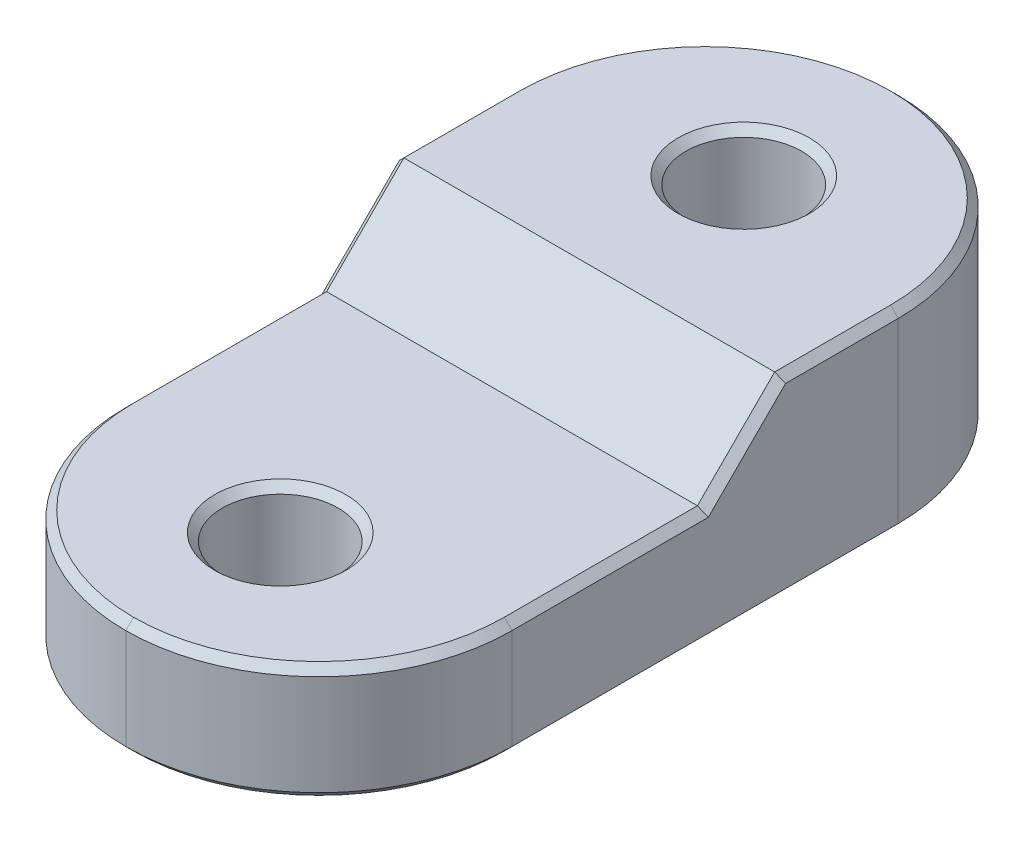
ISO-10303-21;
HEADER;
FILE_DESCRIPTION(('STEP AP214'),'2;1');
FILE_NAME('part.step','',(''),(''),'','','');
FILE_SCHEMA(('AUTOMOTIVE_DESIGN { 1 0 10303 214 1 1 1 1 }'));
ENDSEC;
DATA;
#1=APPLICATION_CONTEXT('core data for automotive mechanical design processes');
#2=APPLICATION_PROTOCOL_DEFINITION('international standard','automotive_design',2000,#1);
#3=PRODUCT_CONTEXT('',#1,'mechanical');
#4=PRODUCT('Part','Part','',(#3));
#5=PRODUCT_RELATED_PRODUCT_CATEGORY('part','',(#4));
#6=PRODUCT_DEFINITION_FORMATION('','',#4);
#7=PRODUCT_DEFINITION_CONTEXT('part definition',#1,'design');
#8=PRODUCT_DEFINITION('design','',#6,#7);
#9=PRODUCT_DEFINITION_SHAPE('','',#8);
#10=(LENGTH_UNIT() NAMED_UNIT(*) SI_UNIT(.MILLI.,.METRE.));
#11=(NAMED_UNIT(*) PLANE_ANGLE_UNIT() SI_UNIT($,.RADIAN.));
#12=(NAMED_UNIT(*) SI_UNIT($,.STERADIAN.) SOLID_ANGLE_UNIT());
#13=UNCERTAINTY_MEASURE_WITH_UNIT(LENGTH_MEASURE(1.E-05),#10,'distance_accuracy_value','');
#14=(GEOMETRIC_REPRESENTATION_CONTEXT(3) GLOBAL_UNCERTAINTY_ASSIGNED_CONTEXT((#13)) GLOBAL_UNIT_ASSIGNED_CONTEXT((#10,
#11,#12)) REPRESENTATION_CONTEXT('',''));
#15=CARTESIAN_POINT('',(0.,0.,0.));
#16=DIRECTION('',(0.,0.,1.));
#17=DIRECTION('',(1.,0.,0.));
#18=AXIS2_PLACEMENT_3D('',#15,#16,#17);
#19=CARTESIAN_POINT('',(10.,0.,-32.));
#20=DIRECTION('',(0.,1.,0.));
#21=DIRECTION('',(0.,0.,1.));
#22=AXIS2_PLACEMENT_3D('',#19,#20,#21);
#23=CYLINDRICAL_SURFACE('',#22,3.);
#24=CARTESIAN_POINT('',(10.,9.59999999999999,-32.));
#25=DIRECTION('',(0.,-1.,0.));
#26=DIRECTION('',(0.,0.,-1.));
#27=AXIS2_PLACEMENT_3D('',#24,#25,#26);
#28=CIRCLE('',#27,3.);
#29=CARTESIAN_POINT('',(10.,9.59999999999999,-35.));
#30=VERTEX_POINT('',#29);
#31=EDGE_CURVE('E11',#30,#30,#28,.F.);
#32=ORIENTED_EDGE('',*,*,#31,.T.);
#33=EDGE_LOOP('',(#32));
#34=FACE_BOUND('',#33,.T.);
#35=CARTESIAN_POINT('',(10.,4.,-32.));
#36=DIRECTION('',(0.,-1.,0.));
#37=DIRECTION('',(0.,0.,-1.));
#38=AXIS2_PLACEMENT_3D('',#35,#36,#37);
#39=CIRCLE('',#38,3.);
#40=CARTESIAN_POINT('',(10.,4.,-35.));
#41=VERTEX_POINT('',#40);
#42=EDGE_CURVE('E505',#41,#41,#39,.F.);
#43=ORIENTED_EDGE('',*,*,#42,.F.);
#44=EDGE_LOOP('',(#43));
#45=FACE_BOUND('',#44,.T.);
#46=ADVANCED_FACE('F39',(#34,#45),#23,.F.);
#47=CARTESIAN_POINT('',(10.,0.,-8.));
#48=DIRECTION('',(0.,1.,0.));
#49=DIRECTION('',(0.,0.,1.));
#50=AXIS2_PLACEMENT_3D('',#47,#48,#49);
#51=CYLINDRICAL_SURFACE('',#50,3.);
#52=CARTESIAN_POINT('',(10.,0.400000000000004,-8.));
#53=DIRECTION('',(0.,-1.,0.));
#54=DIRECTION('',(0.,0.,-1.));
#55=AXIS2_PLACEMENT_3D('',#52,#53,#54);
#56=CIRCLE('',#55,3.);
#57=CARTESIAN_POINT('',(10.,0.400000000000004,-11.));
#58=VERTEX_POINT('',#57);
#59=EDGE_CURVE('E448',#58,#58,#56,.T.);
#60=ORIENTED_EDGE('',*,*,#59,.T.);
#61=EDGE_LOOP('',(#60));
#62=FACE_BOUND('',#61,.T.);
#63=CARTESIAN_POINT('',(10.,5.6,-8.));
#64=DIRECTION('',(0.,1.,0.));
#65=DIRECTION('',(0.,0.,1.));
#66=AXIS2_PLACEMENT_3D('',#63,#64,#65);
#67=CIRCLE('',#66,3.);
#68=CARTESIAN_POINT('',(10.,5.6,-5.));
#69=VERTEX_POINT('',#68);
#70=EDGE_CURVE('E445',#69,#69,#67,.T.);
#71=ORIENTED_EDGE('',*,*,#70,.T.);
#72=EDGE_LOOP('',(#71));
#73=FACE_BOUND('',#72,.T.);
#74=ADVANCED_FACE('F335',(#62,#73),#51,.F.);
#75=CARTESIAN_POINT('',(0.,10.,0.));
#76=DIRECTION('',(1.,0.,0.));
#77=DIRECTION('',(0.,0.,-1.));
#78=AXIS2_PLACEMENT_3D('',#75,#76,#77);
#79=PLANE('',#78);
#80=DIRECTION('',(0.,-1.,0.));
#81=VECTOR('',#80,1.);
#82=CARTESIAN_POINT('',(0.,10.,-30.));
#83=LINE('',#82,#81);
#84=CARTESIAN_POINT('',(0.,9.60000000000001,-30.));
#85=VERTEX_POINT('',#84);
#86=CARTESIAN_POINT('',(0.,0.399999999999999,-30.));
#87=VERTEX_POINT('',#86);
#88=EDGE_CURVE('E513',#85,#87,#83,.T.);
#89=ORIENTED_EDGE('',*,*,#88,.T.);
#90=DIRECTION('',(0.,0.,1.));
#91=VECTOR('',#90,1.);
#92=CARTESIAN_POINT('',(0.,0.399999999999999,-10.));
#93=LINE('',#92,#91);
#94=CARTESIAN_POINT('',(0.,0.399999999999999,-10.));
#95=VERTEX_POINT('',#94);
#96=EDGE_CURVE('E484',#87,#95,#93,.T.);
#97=ORIENTED_EDGE('',*,*,#96,.T.);
#98=DIRECTION('',(0.,-1.,0.));
#99=VECTOR('',#98,1.);
#100=CARTESIAN_POINT('',(0.,10.,-10.));
#101=LINE('',#100,#99);
#102=CARTESIAN_POINT('',(0.,5.6,-10.));
#103=VERTEX_POINT('',#102);
#104=EDGE_CURVE('E500',#95,#103,#101,.F.);
#105=ORIENTED_EDGE('',*,*,#104,.T.);
#106=DIRECTION('',(0.,0.,-1.));
#107=VECTOR('',#106,1.);
#108=CARTESIAN_POINT('',(0.,5.6,-20.));
#109=LINE('',#108,#107);
#110=CARTESIAN_POINT('',(0.,5.59999999999999,-20.1656854249492));
#111=VERTEX_POINT('',#110);
#112=EDGE_CURVE('E522',#103,#111,#109,.T.);
#113=ORIENTED_EDGE('',*,*,#112,.T.);
#114=DIRECTION('',(0.,0.707106781186546,-0.707106781186549));
#115=VECTOR('',#114,1.);
#116=CARTESIAN_POINT('',(0.,9.71715728752538,-24.2828427124746));
#117=LINE('',#116,#115);
#118=CARTESIAN_POINT('',(0.,9.60000000000001,-24.1656854249493));
#119=VERTEX_POINT('',#118);
#120=EDGE_CURVE('E520',#111,#119,#117,.T.);
#121=ORIENTED_EDGE('',*,*,#120,.T.);
#122=DIRECTION('',(0.,0.,-1.));
#123=VECTOR('',#122,1.);
#124=CARTESIAN_POINT('',(0.,9.60000000000001,0.));
#125=LINE('',#124,#123);
#126=EDGE_CURVE('E156',#119,#85,#125,.T.);
#127=ORIENTED_EDGE('',*,*,#126,.T.);
#128=EDGE_LOOP('',(#89,#97,#105,#113,#121,#127));
#129=FACE_BOUND('',#128,.T.);
#130=ADVANCED_FACE('F341',(#129),#79,.F.);
#131=CARTESIAN_POINT('',(20.,10.,0.));
#132=DIRECTION('',(-1.,0.,0.));
#133=DIRECTION('',(0.,0.,1.));
#134=AXIS2_PLACEMENT_3D('',#131,#132,#133);
#135=PLANE('',#134);
#136=DIRECTION('',(0.,-1.,0.));
#137=VECTOR('',#136,1.);
#138=CARTESIAN_POINT('',(20.,10.,-10.));
#139=LINE('',#138,#137);
#140=CARTESIAN_POINT('',(20.,5.6,-10.));
#141=VERTEX_POINT('',#140);
#142=CARTESIAN_POINT('',(20.,0.399999999999999,-10.));
#143=VERTEX_POINT('',#142);
#144=EDGE_CURVE('E552',#141,#143,#139,.T.);
#145=ORIENTED_EDGE('',*,*,#144,.T.);
#146=DIRECTION('',(0.,0.,-1.));
#147=VECTOR('',#146,1.);
#148=CARTESIAN_POINT('',(20.,0.399999999999999,-30.));
#149=LINE('',#148,#147);
#150=CARTESIAN_POINT('',(20.,0.399999999999999,-30.));
#151=VERTEX_POINT('',#150);
#152=EDGE_CURVE('E436',#143,#151,#149,.T.);
#153=ORIENTED_EDGE('',*,*,#152,.T.);
#154=DIRECTION('',(0.,-1.,0.));
#155=VECTOR('',#154,1.);
#156=CARTESIAN_POINT('',(20.,10.,-30.));
#157=LINE('',#156,#155);
#158=CARTESIAN_POINT('',(20.,9.60000000000001,-30.));
#159=VERTEX_POINT('',#158);
#160=EDGE_CURVE('E535',#151,#159,#157,.F.);
#161=ORIENTED_EDGE('',*,*,#160,.T.);
#162=DIRECTION('',(0.,0.,1.));
#163=VECTOR('',#162,1.);
#164=CARTESIAN_POINT('',(20.,9.60000000000001,0.));
#165=LINE('',#164,#163);
#166=CARTESIAN_POINT('',(20.,9.60000000000001,-24.1656854249493));
#167=VERTEX_POINT('',#166);
#168=EDGE_CURVE('E424',#159,#167,#165,.T.);
#169=ORIENTED_EDGE('',*,*,#168,.T.);
#170=DIRECTION('',(0.,-0.707106781186546,0.707106781186549));
#171=VECTOR('',#170,1.);
#172=CARTESIAN_POINT('',(20.,5.71715728752538,-20.2828427124746));
#173=LINE('',#172,#171);
#174=CARTESIAN_POINT('',(20.,5.6,-20.1656854249492));
#175=VERTEX_POINT('',#174);
#176=EDGE_CURVE('E427',#167,#175,#173,.T.);
#177=ORIENTED_EDGE('',*,*,#176,.T.);
#178=DIRECTION('',(0.,0.,1.));
#179=VECTOR('',#178,1.);
#180=CARTESIAN_POINT('',(20.,5.6,-10.));
#181=LINE('',#180,#179);
#182=EDGE_CURVE('E434',#175,#141,#181,.T.);
#183=ORIENTED_EDGE('',*,*,#182,.T.);
#184=EDGE_LOOP('',(#145,#153,#161,#169,#177,#183));
#185=FACE_BOUND('',#184,.T.);
#186=ADVANCED_FACE('F353',(#185),#135,.F.);
#187=CARTESIAN_POINT('',(0.,10.,0.));
#188=DIRECTION('',(0.,-1.,0.));
#189=DIRECTION('',(0.,0.,-1.));
#190=AXIS2_PLACEMENT_3D('',#187,#188,#189);
#191=PLANE('',#190);
#192=CARTESIAN_POINT('',(10.,10.,-32.));
#193=DIRECTION('',(0.,-1.,0.));
#194=DIRECTION('',(0.,0.,-1.));
#195=AXIS2_PLACEMENT_3D('',#192,#193,#194);
#196=CIRCLE('',#195,3.40000000000001);
#197=CARTESIAN_POINT('',(10.,10.,-35.4));
#198=VERTEX_POINT('',#197);
#199=EDGE_CURVE('E470',#198,#198,#196,.T.);
#200=ORIENTED_EDGE('',*,*,#199,.T.);
#201=EDGE_LOOP('',(#200));
#202=FACE_BOUND('',#201,.T.);
#203=CARTESIAN_POINT('',(10.,10.,-30.));
#204=DIRECTION('',(0.,-1.,0.));
#205=DIRECTION('',(0.,0.,-1.));
#206=AXIS2_PLACEMENT_3D('',#203,#204,#205);
#207=CIRCLE('',#206,9.6);
#208=CARTESIAN_POINT('',(10.,10.,-39.6));
#209=VERTEX_POINT('',#208);
#210=CARTESIAN_POINT('',(0.399999999999998,10.,-30.));
#211=VERTEX_POINT('',#210);
#212=EDGE_CURVE('E58',#209,#211,#207,.F.);
#213=ORIENTED_EDGE('',*,*,#212,.T.);
#214=DIRECTION('',(0.,0.,1.));
#215=VECTOR('',#214,1.);
#216=CARTESIAN_POINT('',(0.399999999999998,10.,0.));
#217=LINE('',#216,#215);
#218=CARTESIAN_POINT('',(0.399999999999998,10.,-24.));
#219=VERTEX_POINT('',#218);
#220=EDGE_CURVE('E50',#211,#219,#217,.T.);
#221=ORIENTED_EDGE('',*,*,#220,.T.);
#222=DIRECTION('',(1.,0.,0.));
#223=VECTOR('',#222,1.);
#224=CARTESIAN_POINT('',(0.,10.,-24.));
#225=LINE('',#224,#223);
#226=CARTESIAN_POINT('',(19.6,10.,-24.));
#227=VERTEX_POINT('',#226);
#228=EDGE_CURVE('E509',#219,#227,#225,.T.);
#229=ORIENTED_EDGE('',*,*,#228,.T.);
#230=DIRECTION('',(0.,0.,-1.));
#231=VECTOR('',#230,1.);
#232=CARTESIAN_POINT('',(19.6,10.,0.));
#233=LINE('',#232,#231);
#234=CARTESIAN_POINT('',(19.6,10.,-30.));
#235=VERTEX_POINT('',#234);
#236=EDGE_CURVE('E476',#227,#235,#233,.T.);
#237=ORIENTED_EDGE('',*,*,#236,.T.);
#238=CARTESIAN_POINT('',(10.,10.,-30.));
#239=DIRECTION('',(0.,-1.,0.));
#240=DIRECTION('',(0.,0.,-1.));
#241=AXIS2_PLACEMENT_3D('',#238,#239,#240);
#242=CIRCLE('',#241,9.6);
#243=EDGE_CURVE('E473',#235,#209,#242,.F.);
#244=ORIENTED_EDGE('',*,*,#243,.T.);
#245=EDGE_LOOP('',(#213,#221,#229,#237,#244));
#246=FACE_BOUND('',#245,.T.);
#247=ADVANCED_FACE('F349',(#202,#246),#191,.F.);
#248=CARTESIAN_POINT('',(0.,0.,0.));
#249=DIRECTION('',(0.,-1.,0.));
#250=DIRECTION('',(0.,0.,-1.));
#251=AXIS2_PLACEMENT_3D('',#248,#249,#250);
#252=PLANE('',#251);
#253=CARTESIAN_POINT('',(10.,0.,-8.));
#254=DIRECTION('',(0.,-1.,0.));
#255=DIRECTION('',(0.,0.,-1.));
#256=AXIS2_PLACEMENT_3D('',#253,#254,#255);
#257=CIRCLE('',#256,3.4);
#258=CARTESIAN_POINT('',(10.,0.,-11.4));
#259=VERTEX_POINT('',#258);
#260=EDGE_CURVE('E488',#259,#259,#257,.F.);
#261=ORIENTED_EDGE('',*,*,#260,.T.);
#262=EDGE_LOOP('',(#261));
#263=FACE_BOUND('',#262,.T.);
#264=CARTESIAN_POINT('',(10.,0.,-10.));
#265=DIRECTION('',(0.,-1.,0.));
#266=DIRECTION('',(0.,0.,-1.));
#267=AXIS2_PLACEMENT_3D('',#264,#265,#266);
#268=CIRCLE('',#267,9.6);
#269=CARTESIAN_POINT('',(10.,0.,-0.400000000000001));
#270=VERTEX_POINT('',#269);
#271=CARTESIAN_POINT('',(0.399999999999999,0.,-10.));
#272=VERTEX_POINT('',#271);
#273=EDGE_CURVE('E413',#270,#272,#268,.T.);
#274=ORIENTED_EDGE('',*,*,#273,.T.);
#275=DIRECTION('',(0.,0.,-1.));
#276=VECTOR('',#275,1.);
#277=CARTESIAN_POINT('',(0.399999999999999,0.,-30.));
#278=LINE('',#277,#276);
#279=CARTESIAN_POINT('',(0.399999999999996,0.,-30.));
#280=VERTEX_POINT('',#279);
#281=EDGE_CURVE('E483',#272,#280,#278,.T.);
#282=ORIENTED_EDGE('',*,*,#281,.T.);
#283=CARTESIAN_POINT('',(10.,0.,-30.));
#284=DIRECTION('',(0.,-1.,0.));
#285=DIRECTION('',(0.,0.,-1.));
#286=AXIS2_PLACEMENT_3D('',#283,#284,#285);
#287=CIRCLE('',#286,9.6);
#288=CARTESIAN_POINT('',(5.4208522899998,0.,-38.4375));
#289=VERTEX_POINT('',#288);
#290=EDGE_CURVE('E485',#280,#289,#287,.T.);
#291=ORIENTED_EDGE('',*,*,#290,.T.);
#292=CARTESIAN_POINT('',(10.,0.,-32.));
#293=DIRECTION('',(0.,-1.,0.));
#294=DIRECTION('',(0.,0.,-1.));
#295=AXIS2_PLACEMENT_3D('',#292,#293,#294);
#296=CIRCLE('',#295,7.9);
#297=CARTESIAN_POINT('',(14.5791477100002,0.,-38.4375));
#298=VERTEX_POINT('',#297);
#299=EDGE_CURVE('E180',#289,#298,#296,.F.);
#300=ORIENTED_EDGE('',*,*,#299,.T.);
#301=CARTESIAN_POINT('',(10.,0.,-30.));
#302=DIRECTION('',(0.,-1.,0.));
#303=DIRECTION('',(0.,0.,-1.));
#304=AXIS2_PLACEMENT_3D('',#301,#302,#303);
#305=CIRCLE('',#304,9.60000000000001);
#306=CARTESIAN_POINT('',(19.6,0.,-30.));
#307=VERTEX_POINT('',#306);
#308=EDGE_CURVE('E171',#298,#307,#305,.T.);
#309=ORIENTED_EDGE('',*,*,#308,.T.);
#310=DIRECTION('',(0.,0.,1.));
#311=VECTOR('',#310,1.);
#312=CARTESIAN_POINT('',(19.6,0.,-10.));
#313=LINE('',#312,#311);
#314=CARTESIAN_POINT('',(19.6,0.,-10.));
#315=VERTEX_POINT('',#314);
#316=EDGE_CURVE('E527',#307,#315,#313,.T.);
#317=ORIENTED_EDGE('',*,*,#316,.T.);
#318=CARTESIAN_POINT('',(10.,0.,-10.));
#319=DIRECTION('',(0.,-1.,0.));
#320=DIRECTION('',(0.,0.,-1.));
#321=AXIS2_PLACEMENT_3D('',#318,#319,#320);
#322=CIRCLE('',#321,9.6);
#323=EDGE_CURVE('E418',#315,#270,#322,.T.);
#324=ORIENTED_EDGE('',*,*,#323,.T.);
#325=EDGE_LOOP('',(#274,#282,#291,#300,#309,#317,#324));
#326=FACE_BOUND('',#325,.T.);
#327=ADVANCED_FACE('F352',(#263,#326),#252,.T.);
#328=CARTESIAN_POINT('',(0.,6.,0.));
#329=DIRECTION('',(0.,1.,0.));
#330=DIRECTION('',(0.,0.,1.));
#331=AXIS2_PLACEMENT_3D('',#328,#329,#330);
#332=PLANE('',#331);
#333=CARTESIAN_POINT('',(10.,6.,-8.));
#334=DIRECTION('',(0.,1.,0.));
#335=DIRECTION('',(0.,0.,1.));
#336=AXIS2_PLACEMENT_3D('',#333,#334,#335);
#337=CIRCLE('',#336,3.4);
#338=CARTESIAN_POINT('',(10.,6.,-4.6));
#339=VERTEX_POINT('',#338);
#340=EDGE_CURVE('E467',#339,#339,#337,.F.);
#341=ORIENTED_EDGE('',*,*,#340,.T.);
#342=EDGE_LOOP('',(#341));
#343=FACE_BOUND('',#342,.T.);
#344=CARTESIAN_POINT('',(10.,6.,-10.));
#345=DIRECTION('',(0.,1.,0.));
#346=DIRECTION('',(0.,0.,1.));
#347=AXIS2_PLACEMENT_3D('',#344,#345,#346);
#348=CIRCLE('',#347,9.6);
#349=CARTESIAN_POINT('',(10.,6.,-0.400000000000005));
#350=VERTEX_POINT('',#349);
#351=CARTESIAN_POINT('',(19.6,6.,-10.));
#352=VERTEX_POINT('',#351);
#353=EDGE_CURVE('E463',#350,#352,#348,.T.);
#354=ORIENTED_EDGE('',*,*,#353,.T.);
#355=DIRECTION('',(0.,0.,-1.));
#356=VECTOR('',#355,1.);
#357=CARTESIAN_POINT('',(19.6,6.,-20.));
#358=LINE('',#357,#356);
#359=CARTESIAN_POINT('',(19.6,6.,-20.));
#360=VERTEX_POINT('',#359);
#361=EDGE_CURVE('E465',#352,#360,#358,.T.);
#362=ORIENTED_EDGE('',*,*,#361,.T.);
#363=DIRECTION('',(-1.,0.,0.));
#364=VECTOR('',#363,1.);
#365=CARTESIAN_POINT('',(0.,6.,-20.));
#366=LINE('',#365,#364);
#367=CARTESIAN_POINT('',(0.400000000000005,6.,-20.));
#368=VERTEX_POINT('',#367);
#369=EDGE_CURVE('E555',#360,#368,#366,.T.);
#370=ORIENTED_EDGE('',*,*,#369,.T.);
#371=DIRECTION('',(0.,0.,1.));
#372=VECTOR('',#371,1.);
#373=CARTESIAN_POINT('',(0.400000000000005,6.,-10.));
#374=LINE('',#373,#372);
#375=CARTESIAN_POINT('',(0.400000000000005,6.,-10.));
#376=VERTEX_POINT('',#375);
#377=EDGE_CURVE('E459',#368,#376,#374,.T.);
#378=ORIENTED_EDGE('',*,*,#377,.T.);
#379=CARTESIAN_POINT('',(10.,6.,-10.));
#380=DIRECTION('',(0.,1.,0.));
#381=DIRECTION('',(0.,0.,1.));
#382=AXIS2_PLACEMENT_3D('',#379,#380,#381);
#383=CIRCLE('',#382,9.6);
#384=EDGE_CURVE('E461',#376,#350,#383,.T.);
#385=ORIENTED_EDGE('',*,*,#384,.T.);
#386=EDGE_LOOP('',(#354,#362,#370,#378,#385));
#387=FACE_BOUND('',#386,.T.);
#388=ADVANCED_FACE('F346',(#343,#387),#332,.T.);
#389=CARTESIAN_POINT('',(10.,4.,-32.));
#390=DIRECTION('',(0.,-1.,0.));
#391=DIRECTION('',(0.,0.,-1.));
#392=AXIS2_PLACEMENT_3D('',#389,#390,#391);
#393=CYLINDRICAL_SURFACE('',#392,7.5);
#394=CARTESIAN_POINT('',(10.,0.400000000000004,-32.));
#395=DIRECTION('',(0.,-1.,0.));
#396=DIRECTION('',(0.,0.,-1.));
#397=AXIS2_PLACEMENT_3D('',#394,#395,#396);
#398=CIRCLE('',#397,7.5);
#399=CARTESIAN_POINT('',(10.,0.400000000000004,-39.5));
#400=VERTEX_POINT('',#399);
#401=EDGE_CURVE('E451',#400,#400,#398,.T.);
#402=ORIENTED_EDGE('',*,*,#401,.T.);
#403=EDGE_LOOP('',(#402));
#404=FACE_BOUND('',#403,.T.);
#405=CARTESIAN_POINT('',(10.,2.60000000000001,-32.));
#406=DIRECTION('',(0.,-1.,0.));
#407=DIRECTION('',(0.,0.,-1.));
#408=AXIS2_PLACEMENT_3D('',#405,#406,#407);
#409=CIRCLE('',#408,7.5);
#410=CARTESIAN_POINT('',(10.,2.60000000000001,-39.5));
#411=VERTEX_POINT('',#410);
#412=EDGE_CURVE('E516',#411,#411,#409,.F.);
#413=ORIENTED_EDGE('',*,*,#412,.T.);
#414=EDGE_LOOP('',(#413));
#415=FACE_BOUND('',#414,.T.);
#416=ADVANCED_FACE('F371',(#404,#415),#393,.F.);
#417=CARTESIAN_POINT('',(10.,10.,-30.));
#418=DIRECTION('',(0.,-1.,0.));
#419=DIRECTION('',(0.,0.,-1.));
#420=AXIS2_PLACEMENT_3D('',#417,#418,#419);
#421=CYLINDRICAL_SURFACE('',#420,10.);
#422=DIRECTION('',(0.,-1.,0.));
#423=VECTOR('',#422,1.);
#424=CARTESIAN_POINT('',(10.,10.,-40.));
#425=LINE('',#424,#423);
#426=CARTESIAN_POINT('',(10.,0.399999999999999,-40.));
#427=VERTEX_POINT('',#426);
#428=CARTESIAN_POINT('',(10.,9.60000000000001,-40.));
#429=VERTEX_POINT('',#428);
#430=EDGE_CURVE('E502',#427,#429,#425,.F.);
#431=ORIENTED_EDGE('',*,*,#430,.F.);
#432=CARTESIAN_POINT('',(10.,0.399999999999999,-30.));
#433=DIRECTION('',(0.,-1.,0.));
#434=DIRECTION('',(0.,0.,-1.));
#435=AXIS2_PLACEMENT_3D('',#432,#433,#434);
#436=CIRCLE('',#435,10.);
#437=EDGE_CURVE('E187',#427,#87,#436,.F.);
#438=ORIENTED_EDGE('',*,*,#437,.T.);
#439=ORIENTED_EDGE('',*,*,#88,.F.);
#440=CARTESIAN_POINT('',(10.,9.60000000000001,-30.));
#441=DIRECTION('',(0.,-1.,0.));
#442=DIRECTION('',(0.,0.,-1.));
#443=AXIS2_PLACEMENT_3D('',#440,#441,#442);
#444=CIRCLE('',#443,10.);
#445=EDGE_CURVE('E442',#85,#429,#444,.T.);
#446=ORIENTED_EDGE('',*,*,#445,.T.);
#447=EDGE_LOOP('',(#431,#438,#439,#446));
#448=FACE_BOUND('',#447,.T.);
#449=ADVANCED_FACE('F367',(#448),#421,.T.);
#450=CARTESIAN_POINT('',(10.,10.,-30.));
#451=DIRECTION('',(0.,-1.,0.));
#452=DIRECTION('',(0.,0.,-1.));
#453=AXIS2_PLACEMENT_3D('',#450,#451,#452);
#454=CYLINDRICAL_SURFACE('',#453,10.);
#455=ORIENTED_EDGE('',*,*,#160,.F.);
#456=CARTESIAN_POINT('',(10.,0.399999999999999,-30.));
#457=DIRECTION('',(0.,-1.,0.));
#458=DIRECTION('',(0.,0.,-1.));
#459=AXIS2_PLACEMENT_3D('',#456,#457,#458);
#460=CIRCLE('',#459,10.);
#461=EDGE_CURVE('E440',#151,#427,#460,.F.);
#462=ORIENTED_EDGE('',*,*,#461,.T.);
#463=ORIENTED_EDGE('',*,*,#430,.T.);
#464=CARTESIAN_POINT('',(10.,9.60000000000001,-30.));
#465=DIRECTION('',(0.,-1.,0.));
#466=DIRECTION('',(0.,0.,-1.));
#467=AXIS2_PLACEMENT_3D('',#464,#465,#466);
#468=CIRCLE('',#467,10.);
#469=EDGE_CURVE('E438',#429,#159,#468,.T.);
#470=ORIENTED_EDGE('',*,*,#469,.T.);
#471=EDGE_LOOP('',(#455,#462,#463,#470));
#472=FACE_BOUND('',#471,.T.);
#473=ADVANCED_FACE('F363',(#472),#454,.T.);
#474=CARTESIAN_POINT('',(10.,10.,-10.));
#475=DIRECTION('',(0.,-1.,0.));
#476=DIRECTION('',(0.,0.,-1.));
#477=AXIS2_PLACEMENT_3D('',#474,#475,#476);
#478=CYLINDRICAL_SURFACE('',#477,10.);
#479=DIRECTION('',(0.,-1.,0.));
#480=VECTOR('',#479,1.);
#481=CARTESIAN_POINT('',(10.,10.,0.));
#482=LINE('',#481,#480);
#483=CARTESIAN_POINT('',(10.,0.399999999999999,0.));
#484=VERTEX_POINT('',#483);
#485=CARTESIAN_POINT('',(10.,5.6,0.));
#486=VERTEX_POINT('',#485);
#487=EDGE_CURVE('E174',#484,#486,#482,.F.);
#488=ORIENTED_EDGE('',*,*,#487,.F.);
#489=CARTESIAN_POINT('',(10.,0.399999999999999,-10.));
#490=DIRECTION('',(0.,-1.,0.));
#491=DIRECTION('',(0.,0.,-1.));
#492=AXIS2_PLACEMENT_3D('',#489,#490,#491);
#493=CIRCLE('',#492,10.);
#494=EDGE_CURVE('E419',#484,#143,#493,.F.);
#495=ORIENTED_EDGE('',*,*,#494,.T.);
#496=ORIENTED_EDGE('',*,*,#144,.F.);
#497=CARTESIAN_POINT('',(10.,5.6,-10.));
#498=DIRECTION('',(0.,1.,0.));
#499=DIRECTION('',(0.,0.,1.));
#500=AXIS2_PLACEMENT_3D('',#497,#498,#499);
#501=CIRCLE('',#500,10.);
#502=EDGE_CURVE('E425',#141,#486,#501,.F.);
#503=ORIENTED_EDGE('',*,*,#502,.T.);
#504=EDGE_LOOP('',(#488,#495,#496,#503));
#505=FACE_BOUND('',#504,.T.);
#506=ADVANCED_FACE('F366',(#505),#478,.T.);
#507=CARTESIAN_POINT('',(10.,10.,-10.));
#508=DIRECTION('',(0.,-1.,0.));
#509=DIRECTION('',(0.,0.,-1.));
#510=AXIS2_PLACEMENT_3D('',#507,#508,#509);
#511=CYLINDRICAL_SURFACE('',#510,10.);
#512=ORIENTED_EDGE('',*,*,#104,.F.);
#513=CARTESIAN_POINT('',(10.,0.399999999999999,-10.));
#514=DIRECTION('',(0.,-1.,0.));
#515=DIRECTION('',(0.,0.,-1.));
#516=AXIS2_PLACEMENT_3D('',#513,#514,#515);
#517=CIRCLE('',#516,10.);
#518=EDGE_CURVE('E411',#95,#484,#517,.F.);
#519=ORIENTED_EDGE('',*,*,#518,.T.);
#520=ORIENTED_EDGE('',*,*,#487,.T.);
#521=CARTESIAN_POINT('',(10.,5.6,-10.));
#522=DIRECTION('',(0.,1.,0.));
#523=DIRECTION('',(0.,0.,1.));
#524=AXIS2_PLACEMENT_3D('',#521,#522,#523);
#525=CIRCLE('',#524,10.);
#526=EDGE_CURVE('E491',#486,#103,#525,.F.);
#527=ORIENTED_EDGE('',*,*,#526,.T.);
#528=EDGE_LOOP('',(#512,#519,#520,#527));
#529=FACE_BOUND('',#528,.T.);
#530=ADVANCED_FACE('F373',(#529),#511,.T.);
#531=CARTESIAN_POINT('',(10.,3.6,-32.));
#532=DIRECTION('',(0.,-1.,0.));
#533=DIRECTION('',(0.,0.,-1.));
#534=AXIS2_PLACEMENT_3D('',#531,#532,#533);
#535=PLANE('',#534);
#536=CARTESIAN_POINT('',(10.,3.6,-32.));
#537=DIRECTION('',(0.,-1.,0.));
#538=DIRECTION('',(0.,0.,-1.));
#539=AXIS2_PLACEMENT_3D('',#536,#537,#538);
#540=CIRCLE('',#539,6.5);
#541=CARTESIAN_POINT('',(10.,3.6,-38.5));
#542=VERTEX_POINT('',#541);
#543=EDGE_CURVE('E512',#542,#542,#540,.T.);
#544=ORIENTED_EDGE('',*,*,#543,.T.);
#545=EDGE_LOOP('',(#544));
#546=FACE_BOUND('',#545,.T.);
#547=ADVANCED_FACE('F376',(#546),#535,.T.);
#548=CARTESIAN_POINT('',(10.,4.,-32.));
#549=DIRECTION('',(0.,-1.,0.));
#550=DIRECTION('',(0.,0.,-1.));
#551=AXIS2_PLACEMENT_3D('',#548,#549,#550);
#552=PLANE('',#551);
#553=ORIENTED_EDGE('',*,*,#42,.T.);
#554=EDGE_LOOP('',(#553));
#555=FACE_BOUND('',#554,.T.);
#556=ADVANCED_FACE('F387',(#555),#552,.F.);
#557=CARTESIAN_POINT('',(0.,6.,-20.));
#558=DIRECTION('',(0.,-0.707106781186549,-0.707106781186546));
#559=DIRECTION('',(-1.,0.,0.));
#560=AXIS2_PLACEMENT_3D('',#557,#558,#559);
#561=PLANE('',#560);
#562=ORIENTED_EDGE('',*,*,#369,.F.);
#563=DIRECTION('',(0.,-0.707106781186546,0.707106781186549));
#564=VECTOR('',#563,1.);
#565=CARTESIAN_POINT('',(19.6,10.,-24.));
#566=LINE('',#565,#564);
#567=EDGE_CURVE('E456',#360,#227,#566,.F.);
#568=ORIENTED_EDGE('',*,*,#567,.T.);
#569=ORIENTED_EDGE('',*,*,#228,.F.);
#570=DIRECTION('',(0.,0.707106781186546,-0.707106781186549));
#571=VECTOR('',#570,1.);
#572=CARTESIAN_POINT('',(0.400000000000005,6.,-20.));
#573=LINE('',#572,#571);
#574=EDGE_CURVE('E454',#219,#368,#573,.F.);
#575=ORIENTED_EDGE('',*,*,#574,.T.);
#576=EDGE_LOOP('',(#562,#568,#569,#575));
#577=FACE_BOUND('',#576,.T.);
#578=ADVANCED_FACE('F382',(#577),#561,.F.);
#579=CARTESIAN_POINT('',(10.,3.6,-32.));
#580=DIRECTION('',(0.,-1.,0.));
#581=DIRECTION('',(0.,0.,-1.));
#582=AXIS2_PLACEMENT_3D('',#579,#580,#581);
#583=CONICAL_SURFACE('',#582,6.5,0.785398163397454);
#584=ORIENTED_EDGE('',*,*,#412,.F.);
#585=EDGE_LOOP('',(#584));
#586=FACE_BOUND('',#585,.T.);
#587=ORIENTED_EDGE('',*,*,#543,.F.);
#588=EDGE_LOOP('',(#587));
#589=FACE_BOUND('',#588,.T.);
#590=ADVANCED_FACE('F242',(#586,#589),#583,.F.);
#591=CARTESIAN_POINT('',(20.,0.399999999999999,0.));
#592=DIRECTION('',(0.707106781186546,-0.707106781186549,0.));
#593=DIRECTION('',(0.,0.,1.));
#594=AXIS2_PLACEMENT_3D('',#591,#592,#593);
#595=PLANE('',#594);
#596=DIRECTION('',(0.707106781186549,0.707106781186546,0.));
#597=VECTOR('',#596,1.);
#598=CARTESIAN_POINT('',(19.6,0.,-10.));
#599=LINE('',#598,#597);
#600=EDGE_CURVE('E183',#315,#143,#599,.T.);
#601=ORIENTED_EDGE('',*,*,#600,.F.);
#602=ORIENTED_EDGE('',*,*,#316,.F.);
#603=DIRECTION('',(-0.707106781186549,-0.707106781186546,0.));
#604=VECTOR('',#603,1.);
#605=CARTESIAN_POINT('',(20.,0.399999999999999,-30.));
#606=LINE('',#605,#604);
#607=EDGE_CURVE('E175',#151,#307,#606,.T.);
#608=ORIENTED_EDGE('',*,*,#607,.F.);
#609=ORIENTED_EDGE('',*,*,#152,.F.);
#610=EDGE_LOOP('',(#601,#602,#608,#609));
#611=FACE_BOUND('',#610,.T.);
#612=ADVANCED_FACE('F212',(#611),#595,.T.);
#613=CARTESIAN_POINT('',(10.,0.400000000000004,-32.));
#614=DIRECTION('',(0.,-1.,0.));
#615=DIRECTION('',(0.,0.,-1.));
#616=AXIS2_PLACEMENT_3D('',#613,#614,#615);
#617=CONICAL_SURFACE('',#616,7.5,0.785398163397454);
#618=ORIENTED_EDGE('',*,*,#401,.F.);
#619=EDGE_LOOP('',(#618));
#620=FACE_BOUND('',#619,.T.);
#621=CARTESIAN_POINT('',(14.5819517650779,-0.000200000000000565,-38.43575));
#622=CARTESIAN_POINT('',(14.3739543100202,0.0146454785175228,-38.5656479366501));
#623=CARTESIAN_POINT('',(14.1603745395846,0.0284823267031458,-38.6867203584273));
#624=CARTESIAN_POINT('',(13.7235781519464,0.0540476915171832,-38.910417301029));
#625=CARTESIAN_POINT('',(13.5003592501055,0.065775704876517,-39.0130374182491));
#626=CARTESIAN_POINT('',(13.0511713182006,0.0867792907971474,-39.1968187949899));
#627=CARTESIAN_POINT('',(12.8253854704428,0.0961053358276442,-39.2784216886325));
#628=CARTESIAN_POINT('',(12.3678493643954,0.112580351049521,-39.4225780715447));
#629=CARTESIAN_POINT('',(12.1361011018572,0.119730039692554,-39.4851378472661));
#630=CARTESIAN_POINT('',(11.5927507642031,0.1337455653275,-39.6077736966734));
#631=CARTESIAN_POINT('',(11.2794380054106,0.139780550792566,-39.6605798194612));
#632=CARTESIAN_POINT('',(10.8041998273888,0.145884138734135,-39.7139862139278));
#633=CARTESIAN_POINT('',(10.6436273013846,0.147427347791564,-39.7274892931773));
#634=CARTESIAN_POINT('',(10.3219830626732,0.149485394737322,-39.7454972039504));
#635=CARTESIAN_POINT('',(10.1609113854503,0.150000304120085,-39.7500026610504));
#636=CARTESIAN_POINT('',(9.9998,0.149999999735321,-39.749999997684));
#637=B_SPLINE_CURVE_WITH_KNOTS('',3,(#621,#622,#623,#624,#625,#626,#627,#628,#629,#630,#631,
#632,#633,#634,#635,#636),.UNSPECIFIED.,.F.,.F.,(4,2,2,2,2,2,2,4),(0.,0.736805458675053,
1.47378652175273,2.19371273678743,2.91340103374955,3.86455540427512,4.34777986678943,
4.83097073106148),.UNSPECIFIED.);
#638=CARTESIAN_POINT('',(10.,0.150000000000001,-39.75));
#639=VERTEX_POINT('',#638);
#640=EDGE_CURVE('E163',#298,#639,#637,.T.);
#641=ORIENTED_EDGE('',*,*,#640,.F.);
#642=ORIENTED_EDGE('',*,*,#299,.F.);
#643=CARTESIAN_POINT('',(10.0002,0.149999999735322,-39.749999997684));
#644=CARTESIAN_POINT('',(9.75596811810352,0.150003861710863,-39.750033789815));
#645=CARTESIAN_POINT('',(9.5117425259436,0.148817288166279,-39.7396512713597));
#646=CARTESIAN_POINT('',(9.02502909911542,0.144086459055259,-39.6982565168298));
#647=CARTESIAN_POINT('',(8.78254154621735,0.140541829566122,-39.6672410089317));
#648=CARTESIAN_POINT('',(8.30663555654514,0.131226290029794,-39.5857300379673));
#649=CARTESIAN_POINT('',(8.07313672924658,0.12550837120809,-39.5356982481305));
#650=CARTESIAN_POINT('',(7.61123312403885,0.111891885366955,-39.4165539969025));
#651=CARTESIAN_POINT('',(7.38282684470095,0.103993970512363,-39.3474472419536));
#652=CARTESIAN_POINT('',(6.85566856207837,0.0830095386603096,-39.1638334633172));
#653=CARTESIAN_POINT('',(6.55949051914496,0.0690720916601176,-39.0418808021064));
#654=CARTESIAN_POINT('',(6.12467374850636,0.0453197261516782,-38.8340476038737));
#655=CARTESIAN_POINT('',(5.98020583870428,0.0368492833672908,-38.7599312294826));
#656=CARTESIAN_POINT('',(5.6957093756068,0.0189996919950746,-38.6037473049392));
#657=CARTESIAN_POINT('',(5.55568040440511,0.00962062928899559,-38.5216805062522));
#658=CARTESIAN_POINT('',(5.41804823492209,-0.00020000000000042,-38.43575));
#659=B_SPLINE_CURVE_WITH_KNOTS('',3,(#643,#644,#645,#646,#647,#648,#649,#650,#651,#652,#653,
#654,#655,#656,#657,#658),.UNSPECIFIED.,.F.,.F.,(4,2,2,2,2,2,2,4),(0.,0.73246167606387,
1.46503952806251,2.18079517517842,2.89633692938635,3.85589970900697,4.34345709736732,
4.83096844722091),.UNSPECIFIED.);
#660=EDGE_CURVE('E178',#639,#289,#659,.T.);
#661=ORIENTED_EDGE('',*,*,#660,.F.);
#662=EDGE_LOOP('',(#641,#642,#661));
#663=FACE_BOUND('',#662,.T.);
#664=ADVANCED_FACE('F179',(#620,#663),#617,.F.);
#665=CARTESIAN_POINT('',(10.,0.,-30.));
#666=DIRECTION('',(0.,1.,0.));
#667=DIRECTION('',(0.,0.,1.));
#668=AXIS2_PLACEMENT_3D('',#665,#666,#667);
#669=CONICAL_SURFACE('',#668,9.6,0.785398163397444);
#670=ORIENTED_EDGE('',*,*,#308,.F.);
#671=ORIENTED_EDGE('',*,*,#640,.T.);
#672=DIRECTION('',(0.,-0.707106781186549,0.707106781186546));
#673=VECTOR('',#672,1.);
#674=CARTESIAN_POINT('',(10.,0.399999999999999,-40.));
#675=LINE('',#674,#673);
#676=EDGE_CURVE('E168',#427,#639,#675,.T.);
#677=ORIENTED_EDGE('',*,*,#676,.F.);
#678=ORIENTED_EDGE('',*,*,#461,.F.);
#679=ORIENTED_EDGE('',*,*,#607,.T.);
#680=EDGE_LOOP('',(#670,#671,#677,#678,#679));
#681=FACE_BOUND('',#680,.T.);
#682=ADVANCED_FACE('F165',(#681),#669,.T.);
#683=CARTESIAN_POINT('',(10.,0.,-10.));
#684=DIRECTION('',(0.,1.,0.));
#685=DIRECTION('',(0.,0.,1.));
#686=AXIS2_PLACEMENT_3D('',#683,#684,#685);
#687=CONICAL_SURFACE('',#686,9.6,0.78539816339745);
#688=ORIENTED_EDGE('',*,*,#600,.T.);
#689=ORIENTED_EDGE('',*,*,#494,.F.);
#690=DIRECTION('',(0.,0.707106781186546,0.707106781186549));
#691=VECTOR('',#690,1.);
#692=CARTESIAN_POINT('',(10.,0.,-0.400000000000001));
#693=LINE('',#692,#691);
#694=EDGE_CURVE('E188',#270,#484,#693,.T.);
#695=ORIENTED_EDGE('',*,*,#694,.F.);
#696=ORIENTED_EDGE('',*,*,#323,.F.);
#697=EDGE_LOOP('',(#688,#689,#695,#696));
#698=FACE_BOUND('',#697,.T.);
#699=ADVANCED_FACE('F231',(#698),#687,.T.);
#700=CARTESIAN_POINT('',(10.,0.,-30.));
#701=DIRECTION('',(0.,1.,0.));
#702=DIRECTION('',(0.,0.,1.));
#703=AXIS2_PLACEMENT_3D('',#700,#701,#702);
#704=CONICAL_SURFACE('',#703,9.6,0.785398163397448);
#705=ORIENTED_EDGE('',*,*,#660,.T.);
#706=ORIENTED_EDGE('',*,*,#290,.F.);
#707=DIRECTION('',(0.707106781186544,-0.707106781186551,0.));
#708=VECTOR('',#707,1.);
#709=CARTESIAN_POINT('',(0.,0.399999999999999,-30.));
#710=LINE('',#709,#708);
#711=EDGE_CURVE('E191',#87,#280,#710,.T.);
#712=ORIENTED_EDGE('',*,*,#711,.F.);
#713=ORIENTED_EDGE('',*,*,#437,.F.);
#714=ORIENTED_EDGE('',*,*,#676,.T.);
#715=EDGE_LOOP('',(#705,#706,#712,#713,#714));
#716=FACE_BOUND('',#715,.T.);
#717=ADVANCED_FACE('F185',(#716),#704,.T.);
#718=CARTESIAN_POINT('',(10.,0.,-10.));
#719=DIRECTION('',(0.,1.,0.));
#720=DIRECTION('',(0.,0.,1.));
#721=AXIS2_PLACEMENT_3D('',#718,#719,#720);
#722=CONICAL_SURFACE('',#721,9.6,0.785398163397448);
#723=ORIENTED_EDGE('',*,*,#694,.T.);
#724=ORIENTED_EDGE('',*,*,#518,.F.);
#725=DIRECTION('',(-0.707106781186547,0.707106781186548,0.));
#726=VECTOR('',#725,1.);
#727=CARTESIAN_POINT('',(0.399999999999999,0.,-10.));
#728=LINE('',#727,#726);
#729=EDGE_CURVE('E479',#272,#95,#728,.T.);
#730=ORIENTED_EDGE('',*,*,#729,.F.);
#731=ORIENTED_EDGE('',*,*,#273,.F.);
#732=EDGE_LOOP('',(#723,#724,#730,#731));
#733=FACE_BOUND('',#732,.T.);
#734=ADVANCED_FACE('F398',(#733),#722,.T.);
#735=CARTESIAN_POINT('',(0.,0.399999999999999,0.));
#736=DIRECTION('',(-0.707106781186547,-0.707106781186547,0.));
#737=DIRECTION('',(0.,0.,-1.));
#738=AXIS2_PLACEMENT_3D('',#735,#736,#737);
#739=PLANE('',#738);
#740=ORIENTED_EDGE('',*,*,#711,.T.);
#741=ORIENTED_EDGE('',*,*,#281,.F.);
#742=ORIENTED_EDGE('',*,*,#729,.T.);
#743=ORIENTED_EDGE('',*,*,#96,.F.);
#744=EDGE_LOOP('',(#740,#741,#742,#743));
#745=FACE_BOUND('',#744,.T.);
#746=ADVANCED_FACE('F253',(#745),#739,.T.);
#747=CARTESIAN_POINT('',(10.,0.,-8.));
#748=DIRECTION('',(0.,-1.,0.));
#749=DIRECTION('',(0.,0.,-1.));
#750=AXIS2_PLACEMENT_3D('',#747,#748,#749);
#751=CONICAL_SURFACE('',#750,3.4,0.785398163397447);
#752=ORIENTED_EDGE('',*,*,#59,.F.);
#753=EDGE_LOOP('',(#752));
#754=FACE_BOUND('',#753,.T.);
#755=ORIENTED_EDGE('',*,*,#260,.F.);
#756=EDGE_LOOP('',(#755));
#757=FACE_BOUND('',#756,.T.);
#758=ADVANCED_FACE('F245',(#754,#757),#751,.F.);
#759=CARTESIAN_POINT('',(0.,-2.28284271247463,-12.2828427124746));
#760=DIRECTION('',(0.707106781186552,-0.499999999999998,-0.499999999999996));
#761=DIRECTION('',(0.,0.707106781186546,-0.707106781186549));
#762=AXIS2_PLACEMENT_3D('',#759,#760,#761);
#763=PLANE('',#762);
#764=DIRECTION('',(0.678598344545845,0.678598344545845,0.281084637714831));
#765=VECTOR('',#764,1.);
#766=CARTESIAN_POINT('',(-2.12641371769476,3.47358628230524,-21.0464748260346));
#767=LINE('',#766,#765);
#768=EDGE_CURVE('E566',#368,#111,#767,.F.);
#769=ORIENTED_EDGE('',*,*,#768,.F.);
#770=ORIENTED_EDGE('',*,*,#574,.F.);
#771=DIRECTION('',(0.678598344545849,0.678598344545834,0.281084637714848));
#772=VECTOR('',#771,1.);
#773=CARTESIAN_POINT('',(4.97784567593358,14.5778456759335,-22.1037942345771));
#774=LINE('',#773,#772);
#775=EDGE_CURVE('E44',#119,#219,#774,.T.);
#776=ORIENTED_EDGE('',*,*,#775,.F.);
#777=ORIENTED_EDGE('',*,*,#120,.F.);
#778=EDGE_LOOP('',(#769,#770,#776,#777));
#779=FACE_BOUND('',#778,.T.);
#780=ADVANCED_FACE('F252',(#779),#763,.F.);
#781=CARTESIAN_POINT('',(0.399999999999998,10.,0.));
#782=DIRECTION('',(0.707106781186539,-0.707106781186556,0.));
#783=DIRECTION('',(0.,0.,1.));
#784=AXIS2_PLACEMENT_3D('',#781,#782,#783);
#785=PLANE('',#784);
#786=ORIENTED_EDGE('',*,*,#775,.T.);
#787=ORIENTED_EDGE('',*,*,#220,.F.);
#788=DIRECTION('',(0.707106781186556,0.707106781186539,0.));
#789=VECTOR('',#788,1.);
#790=CARTESIAN_POINT('',(0.,9.60000000000001,-30.));
#791=LINE('',#790,#789);
#792=EDGE_CURVE('E539',#85,#211,#791,.T.);
#793=ORIENTED_EDGE('',*,*,#792,.F.);
#794=ORIENTED_EDGE('',*,*,#126,.F.);
#795=EDGE_LOOP('',(#786,#787,#793,#794));
#796=FACE_BOUND('',#795,.T.);
#797=ADVANCED_FACE('F313',(#796),#785,.F.);
#798=CARTESIAN_POINT('',(0.400000000000005,6.,0.));
#799=DIRECTION('',(-0.707106781186547,0.707106781186547,0.));
#800=DIRECTION('',(0.,0.,-1.));
#801=AXIS2_PLACEMENT_3D('',#798,#799,#800);
#802=PLANE('',#801);
#803=ORIENTED_EDGE('',*,*,#768,.T.);
#804=ORIENTED_EDGE('',*,*,#112,.F.);
#805=DIRECTION('',(-0.707106781186547,-0.707106781186547,0.));
#806=VECTOR('',#805,1.);
#807=CARTESIAN_POINT('',(0.400000000000005,6.,-10.));
#808=LINE('',#807,#806);
#809=EDGE_CURVE('E544',#376,#103,#808,.T.);
#810=ORIENTED_EDGE('',*,*,#809,.F.);
#811=ORIENTED_EDGE('',*,*,#377,.F.);
#812=EDGE_LOOP('',(#803,#804,#810,#811));
#813=FACE_BOUND('',#812,.T.);
#814=ADVANCED_FACE('F306',(#813),#802,.T.);
#815=CARTESIAN_POINT('',(10.,10.,-30.));
#816=DIRECTION('',(0.,-1.,0.));
#817=DIRECTION('',(0.,0.,-1.));
#818=AXIS2_PLACEMENT_3D('',#815,#816,#817);
#819=CONICAL_SURFACE('',#818,9.6,0.785398163397459);
#820=ORIENTED_EDGE('',*,*,#792,.T.);
#821=ORIENTED_EDGE('',*,*,#212,.F.);
#822=DIRECTION('',(0.,0.70710678118654,0.707106781186555));
#823=VECTOR('',#822,1.);
#824=CARTESIAN_POINT('',(10.,9.60000000000001,-40.));
#825=LINE('',#824,#823);
#826=EDGE_CURVE('E541',#429,#209,#825,.T.);
#827=ORIENTED_EDGE('',*,*,#826,.F.);
#828=ORIENTED_EDGE('',*,*,#445,.F.);
#829=EDGE_LOOP('',(#820,#821,#827,#828));
#830=FACE_BOUND('',#829,.T.);
#831=ADVANCED_FACE('F299',(#830),#819,.T.);
#832=CARTESIAN_POINT('',(10.,6.,-10.));
#833=DIRECTION('',(0.,-1.,0.));
#834=DIRECTION('',(0.,0.,-1.));
#835=AXIS2_PLACEMENT_3D('',#832,#833,#834);
#836=CONICAL_SURFACE('',#835,9.6,0.785398163397448);
#837=ORIENTED_EDGE('',*,*,#809,.T.);
#838=ORIENTED_EDGE('',*,*,#526,.F.);
#839=DIRECTION('',(0.,-0.707106781186547,0.707106781186547));
#840=VECTOR('',#839,1.);
#841=CARTESIAN_POINT('',(10.,6.,-0.400000000000005));
#842=LINE('',#841,#840);
#843=EDGE_CURVE('E545',#350,#486,#842,.T.);
#844=ORIENTED_EDGE('',*,*,#843,.F.);
#845=ORIENTED_EDGE('',*,*,#384,.F.);
#846=EDGE_LOOP('',(#837,#838,#844,#845));
#847=FACE_BOUND('',#846,.T.);
#848=ADVANCED_FACE('F292',(#847),#836,.T.);
#849=CARTESIAN_POINT('',(10.,10.,-30.));
#850=DIRECTION('',(0.,-1.,0.));
#851=DIRECTION('',(0.,0.,-1.));
#852=AXIS2_PLACEMENT_3D('',#849,#850,#851);
#853=CONICAL_SURFACE('',#852,9.6,0.785398163397457);
#854=ORIENTED_EDGE('',*,*,#826,.T.);
#855=ORIENTED_EDGE('',*,*,#243,.F.);
#856=DIRECTION('',(-0.707106781186555,0.70710678118654,0.));
#857=VECTOR('',#856,1.);
#858=CARTESIAN_POINT('',(20.,9.60000000000001,-30.));
#859=LINE('',#858,#857);
#860=EDGE_CURVE('E549',#159,#235,#859,.T.);
#861=ORIENTED_EDGE('',*,*,#860,.F.);
#862=ORIENTED_EDGE('',*,*,#469,.F.);
#863=EDGE_LOOP('',(#854,#855,#861,#862));
#864=FACE_BOUND('',#863,.T.);
#865=ADVANCED_FACE('F285',(#864),#853,.T.);
#866=CARTESIAN_POINT('',(10.,6.,-10.));
#867=DIRECTION('',(0.,-1.,0.));
#868=DIRECTION('',(0.,0.,-1.));
#869=AXIS2_PLACEMENT_3D('',#866,#867,#868);
#870=CONICAL_SURFACE('',#869,9.6,0.785398163397448);
#871=ORIENTED_EDGE('',*,*,#843,.T.);
#872=ORIENTED_EDGE('',*,*,#502,.F.);
#873=DIRECTION('',(0.707106781186547,-0.707106781186547,0.));
#874=VECTOR('',#873,1.);
#875=CARTESIAN_POINT('',(19.6,6.,-10.));
#876=LINE('',#875,#874);
#877=EDGE_CURVE('E816',#352,#141,#876,.T.);
#878=ORIENTED_EDGE('',*,*,#877,.F.);
#879=ORIENTED_EDGE('',*,*,#353,.F.);
#880=EDGE_LOOP('',(#871,#872,#878,#879));
#881=FACE_BOUND('',#880,.T.);
#882=ADVANCED_FACE('F278',(#881),#870,.T.);
#883=CARTESIAN_POINT('',(19.6,10.,0.));
#884=DIRECTION('',(-0.70710678118654,-0.707106781186555,0.));
#885=DIRECTION('',(0.,0.,-1.));
#886=AXIS2_PLACEMENT_3D('',#883,#884,#885);
#887=PLANE('',#886);
#888=ORIENTED_EDGE('',*,*,#860,.T.);
#889=ORIENTED_EDGE('',*,*,#236,.F.);
#890=DIRECTION('',(0.678598344545848,-0.678598344545833,-0.281084637714851));
#891=VECTOR('',#890,1.);
#892=CARTESIAN_POINT('',(15.0221543240664,14.5778456759335,-22.1037942345771));
#893=LINE('',#892,#891);
#894=EDGE_CURVE('E818',#167,#227,#893,.F.);
#895=ORIENTED_EDGE('',*,*,#894,.F.);
#896=ORIENTED_EDGE('',*,*,#168,.F.);
#897=EDGE_LOOP('',(#888,#889,#895,#896));
#898=FACE_BOUND('',#897,.T.);
#899=ADVANCED_FACE('F271',(#898),#887,.F.);
#900=CARTESIAN_POINT('',(19.6,6.,0.));
#901=DIRECTION('',(0.707106781186547,0.707106781186547,0.));
#902=DIRECTION('',(0.,0.,1.));
#903=AXIS2_PLACEMENT_3D('',#900,#901,#902);
#904=PLANE('',#903);
#905=ORIENTED_EDGE('',*,*,#877,.T.);
#906=ORIENTED_EDGE('',*,*,#182,.F.);
#907=DIRECTION('',(0.678598344545844,-0.678598344545844,-0.281084637714835));
#908=VECTOR('',#907,1.);
#909=CARTESIAN_POINT('',(22.1264137176947,3.47358628230527,-21.0464748260346));
#910=LINE('',#909,#908);
#911=EDGE_CURVE('E222',#360,#175,#910,.T.);
#912=ORIENTED_EDGE('',*,*,#911,.F.);
#913=ORIENTED_EDGE('',*,*,#361,.F.);
#914=EDGE_LOOP('',(#905,#906,#912,#913));
#915=FACE_BOUND('',#914,.T.);
#916=ADVANCED_FACE('F264',(#915),#904,.T.);
#917=CARTESIAN_POINT('',(20.,-2.28284271247463,-12.2828427124746));
#918=DIRECTION('',(-0.707106781186554,-0.499999999999997,-0.499999999999995));
#919=DIRECTION('',(0.,-0.707106781186546,0.707106781186549));
#920=AXIS2_PLACEMENT_3D('',#917,#918,#919);
#921=PLANE('',#920);
#922=ORIENTED_EDGE('',*,*,#894,.T.);
#923=ORIENTED_EDGE('',*,*,#567,.F.);
#924=ORIENTED_EDGE('',*,*,#911,.T.);
#925=ORIENTED_EDGE('',*,*,#176,.F.);
#926=EDGE_LOOP('',(#922,#923,#924,#925));
#927=FACE_BOUND('',#926,.T.);
#928=ADVANCED_FACE('F256',(#927),#921,.F.);
#929=CARTESIAN_POINT('',(10.,6.,-8.));
#930=DIRECTION('',(0.,1.,0.));
#931=DIRECTION('',(0.,0.,1.));
#932=AXIS2_PLACEMENT_3D('',#929,#930,#931);
#933=CONICAL_SURFACE('',#932,3.4,0.785398163397447);
#934=ORIENTED_EDGE('',*,*,#70,.F.);
#935=EDGE_LOOP('',(#934));
#936=FACE_BOUND('',#935,.T.);
#937=ORIENTED_EDGE('',*,*,#340,.F.);
#938=EDGE_LOOP('',(#937));
#939=FACE_BOUND('',#938,.T.);
#940=ADVANCED_FACE('F263',(#936,#939),#933,.F.);
#941=CARTESIAN_POINT('',(10.,9.59999999999999,-32.));
#942=DIRECTION('',(0.,1.,0.));
#943=DIRECTION('',(0.,0.,1.));
#944=AXIS2_PLACEMENT_3D('',#941,#942,#943);
#945=CONICAL_SURFACE('',#944,3.,0.785398163397454);
#946=ORIENTED_EDGE('',*,*,#199,.F.);
#947=EDGE_LOOP('',(#946));
#948=FACE_BOUND('',#947,.T.);
#949=ORIENTED_EDGE('',*,*,#31,.F.);
#950=EDGE_LOOP('',(#949));
#951=FACE_BOUND('',#950,.T.);
#952=ADVANCED_FACE('F42',(#948,#951),#945,.F.);
#953=CLOSED_SHELL('',(#46,#74,#130,#186,#247,#327,#388,#416,#449,#473,#506,#530,#547,#556,#578,
#590,#612,#664,#682,#699,#717,#734,#746,#758,#780,#797,#814,#831,#848,#865,#882,#899,#916,#928,
#940,#952));
#954=MANIFOLD_SOLID_BREP('B2',#953);
#955=ADVANCED_BREP_SHAPE_REPRESENTATION('',(#18,#954),#14);
#956=SHAPE_DEFINITION_REPRESENTATION(#9,#955);
ENDSEC;
END-ISO-10303-21;
